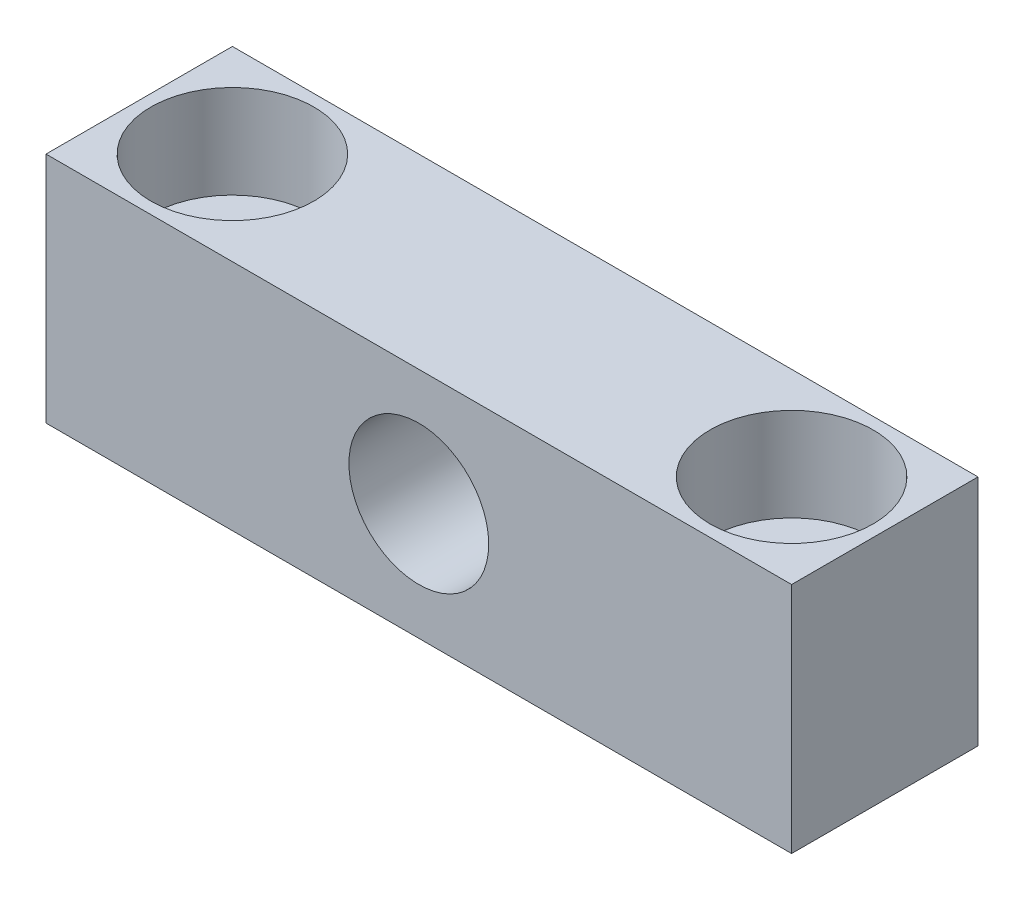
ISO-10303-21;
HEADER;
FILE_DESCRIPTION(('STEP AP214'),'2;1');
FILE_NAME('part.step','',(''),(''),'','','');
FILE_SCHEMA(('AUTOMOTIVE_DESIGN { 1 0 10303 214 1 1 1 1 }'));
ENDSEC;
DATA;
#1=APPLICATION_CONTEXT('core data for automotive mechanical design processes');
#2=APPLICATION_PROTOCOL_DEFINITION('international standard','automotive_design',2000,#1);
#3=PRODUCT_CONTEXT('',#1,'mechanical');
#4=PRODUCT('Part','Part','',(#3));
#5=PRODUCT_RELATED_PRODUCT_CATEGORY('part','',(#4));
#6=PRODUCT_DEFINITION_FORMATION('','',#4);
#7=PRODUCT_DEFINITION_CONTEXT('part definition',#1,'design');
#8=PRODUCT_DEFINITION('design','',#6,#7);
#9=PRODUCT_DEFINITION_SHAPE('','',#8);
#10=(LENGTH_UNIT() NAMED_UNIT(*) SI_UNIT(.MILLI.,.METRE.));
#11=(NAMED_UNIT(*) PLANE_ANGLE_UNIT() SI_UNIT($,.RADIAN.));
#12=(NAMED_UNIT(*) SI_UNIT($,.STERADIAN.) SOLID_ANGLE_UNIT());
#13=UNCERTAINTY_MEASURE_WITH_UNIT(LENGTH_MEASURE(1.E-05),#10,'distance_accuracy_value','');
#14=(GEOMETRIC_REPRESENTATION_CONTEXT(3) GLOBAL_UNCERTAINTY_ASSIGNED_CONTEXT((#13)) GLOBAL_UNIT_ASSIGNED_CONTEXT((#10,
#11,#12)) REPRESENTATION_CONTEXT('',''));
#15=CARTESIAN_POINT('',(0.,0.,0.));
#16=DIRECTION('',(0.,0.,1.));
#17=DIRECTION('',(1.,0.,0.));
#18=AXIS2_PLACEMENT_3D('',#15,#16,#17);
#19=CARTESIAN_POINT('',(-25.4,15.875,-6.35));
#20=DIRECTION('',(1.,0.,0.));
#21=DIRECTION('',(0.,0.,-1.));
#22=AXIS2_PLACEMENT_3D('',#19,#20,#21);
#23=PLANE('',#22);
#24=DIRECTION('',(0.,0.,1.));
#25=VECTOR('',#24,1.);
#26=CARTESIAN_POINT('',(-25.4,0.,-6.35));
#27=LINE('',#26,#25);
#28=CARTESIAN_POINT('',(-25.4,0.,-6.35));
#29=VERTEX_POINT('',#28);
#30=CARTESIAN_POINT('',(-25.4,0.,6.35));
#31=VERTEX_POINT('',#30);
#32=EDGE_CURVE('E100',#29,#31,#27,.T.);
#33=ORIENTED_EDGE('',*,*,#32,.T.);
#34=DIRECTION('',(0.,-1.,0.));
#35=VECTOR('',#34,1.);
#36=CARTESIAN_POINT('',(-25.4,15.875,6.35));
#37=LINE('',#36,#35);
#38=CARTESIAN_POINT('',(-25.4,15.875,6.35));
#39=VERTEX_POINT('',#38);
#40=EDGE_CURVE('E11',#39,#31,#37,.T.);
#41=ORIENTED_EDGE('',*,*,#40,.F.);
#42=DIRECTION('',(0.,0.,1.));
#43=VECTOR('',#42,1.);
#44=CARTESIAN_POINT('',(-25.4,15.875,-6.35));
#45=LINE('',#44,#43);
#46=CARTESIAN_POINT('',(-25.4,15.875,-6.35));
#47=VERTEX_POINT('',#46);
#48=EDGE_CURVE('E88',#47,#39,#45,.T.);
#49=ORIENTED_EDGE('',*,*,#48,.F.);
#50=DIRECTION('',(0.,-1.,0.));
#51=VECTOR('',#50,1.);
#52=CARTESIAN_POINT('',(-25.4,15.875,-6.35));
#53=LINE('',#52,#51);
#54=EDGE_CURVE('E96',#47,#29,#53,.T.);
#55=ORIENTED_EDGE('',*,*,#54,.T.);
#56=EDGE_LOOP('',(#33,#41,#49,#55));
#57=FACE_BOUND('',#56,.T.);
#58=ADVANCED_FACE('F37',(#57),#23,.F.);
#59=CARTESIAN_POINT('',(-25.4,15.875,6.35));
#60=DIRECTION('',(0.,0.,-1.));
#61=DIRECTION('',(-1.,0.,0.));
#62=AXIS2_PLACEMENT_3D('',#59,#60,#61);
#63=PLANE('',#62);
#64=CARTESIAN_POINT('',(0.,7.9375,6.35));
#65=DIRECTION('',(0.,0.,1.));
#66=DIRECTION('',(1.,0.,0.));
#67=AXIS2_PLACEMENT_3D('',#64,#65,#66);
#68=CIRCLE('',#67,4.7625);
#69=CARTESIAN_POINT('',(4.7625,7.9375,6.35));
#70=VERTEX_POINT('',#69);
#71=EDGE_CURVE('E114',#70,#70,#68,.T.);
#72=ORIENTED_EDGE('',*,*,#71,.F.);
#73=EDGE_LOOP('',(#72));
#74=FACE_BOUND('',#73,.T.);
#75=DIRECTION('',(1.,0.,0.));
#76=VECTOR('',#75,1.);
#77=CARTESIAN_POINT('',(-25.4,0.,6.35));
#78=LINE('',#77,#76);
#79=CARTESIAN_POINT('',(25.4,0.,6.35));
#80=VERTEX_POINT('',#79);
#81=EDGE_CURVE('E92',#31,#80,#78,.T.);
#82=ORIENTED_EDGE('',*,*,#81,.T.);
#83=DIRECTION('',(0.,-1.,0.));
#84=VECTOR('',#83,1.);
#85=CARTESIAN_POINT('',(25.4,15.875,6.35));
#86=LINE('',#85,#84);
#87=CARTESIAN_POINT('',(25.4,15.875,6.35));
#88=VERTEX_POINT('',#87);
#89=EDGE_CURVE('E45',#88,#80,#86,.T.);
#90=ORIENTED_EDGE('',*,*,#89,.F.);
#91=DIRECTION('',(1.,0.,0.));
#92=VECTOR('',#91,1.);
#93=CARTESIAN_POINT('',(-25.4,15.875,6.35));
#94=LINE('',#93,#92);
#95=EDGE_CURVE('E83',#39,#88,#94,.T.);
#96=ORIENTED_EDGE('',*,*,#95,.F.);
#97=ORIENTED_EDGE('',*,*,#40,.T.);
#98=EDGE_LOOP('',(#82,#90,#96,#97));
#99=FACE_BOUND('',#98,.T.);
#100=ADVANCED_FACE('F91',(#74,#99),#63,.F.);
#101=CARTESIAN_POINT('',(25.4,15.875,-6.35));
#102=DIRECTION('',(-1.,0.,0.));
#103=DIRECTION('',(0.,0.,1.));
#104=AXIS2_PLACEMENT_3D('',#101,#102,#103);
#105=PLANE('',#104);
#106=DIRECTION('',(0.,0.,-1.));
#107=VECTOR('',#106,1.);
#108=CARTESIAN_POINT('',(25.4,0.,-6.35));
#109=LINE('',#108,#107);
#110=CARTESIAN_POINT('',(25.4,0.,-6.35));
#111=VERTEX_POINT('',#110);
#112=EDGE_CURVE('E70',#80,#111,#109,.T.);
#113=ORIENTED_EDGE('',*,*,#112,.T.);
#114=DIRECTION('',(0.,-1.,0.));
#115=VECTOR('',#114,1.);
#116=CARTESIAN_POINT('',(25.4,15.875,-6.35));
#117=LINE('',#116,#115);
#118=CARTESIAN_POINT('',(25.4,15.875,-6.35));
#119=VERTEX_POINT('',#118);
#120=EDGE_CURVE('E93',#119,#111,#117,.T.);
#121=ORIENTED_EDGE('',*,*,#120,.F.);
#122=DIRECTION('',(0.,0.,-1.));
#123=VECTOR('',#122,1.);
#124=CARTESIAN_POINT('',(25.4,15.875,-6.35));
#125=LINE('',#124,#123);
#126=EDGE_CURVE('E86',#88,#119,#125,.T.);
#127=ORIENTED_EDGE('',*,*,#126,.F.);
#128=ORIENTED_EDGE('',*,*,#89,.T.);
#129=EDGE_LOOP('',(#113,#121,#127,#128));
#130=FACE_BOUND('',#129,.T.);
#131=ADVANCED_FACE('F94',(#130),#105,.F.);
#132=CARTESIAN_POINT('',(-25.4,15.875,-6.35));
#133=DIRECTION('',(0.,0.,1.));
#134=DIRECTION('',(1.,0.,0.));
#135=AXIS2_PLACEMENT_3D('',#132,#133,#134);
#136=PLANE('',#135);
#137=CARTESIAN_POINT('',(0.,7.9375,-6.35));
#138=DIRECTION('',(0.,0.,1.));
#139=DIRECTION('',(1.,0.,0.));
#140=AXIS2_PLACEMENT_3D('',#137,#138,#139);
#141=CIRCLE('',#140,4.7625);
#142=CARTESIAN_POINT('',(4.7625,7.9375,-6.35));
#143=VERTEX_POINT('',#142);
#144=EDGE_CURVE('E103',#143,#143,#141,.T.);
#145=ORIENTED_EDGE('',*,*,#144,.T.);
#146=EDGE_LOOP('',(#145));
#147=FACE_BOUND('',#146,.T.);
#148=DIRECTION('',(-1.,0.,0.));
#149=VECTOR('',#148,1.);
#150=CARTESIAN_POINT('',(-25.4,0.,-6.35));
#151=LINE('',#150,#149);
#152=EDGE_CURVE('E76',#111,#29,#151,.T.);
#153=ORIENTED_EDGE('',*,*,#152,.T.);
#154=ORIENTED_EDGE('',*,*,#54,.F.);
#155=DIRECTION('',(-1.,0.,0.));
#156=VECTOR('',#155,1.);
#157=CARTESIAN_POINT('',(-25.4,15.875,-6.35));
#158=LINE('',#157,#156);
#159=EDGE_CURVE('E53',#119,#47,#158,.T.);
#160=ORIENTED_EDGE('',*,*,#159,.F.);
#161=ORIENTED_EDGE('',*,*,#120,.T.);
#162=EDGE_LOOP('',(#153,#154,#160,#161));
#163=FACE_BOUND('',#162,.T.);
#164=ADVANCED_FACE('F108',(#147,#163),#136,.F.);
#165=CARTESIAN_POINT('',(-25.4,15.875,6.35));
#166=DIRECTION('',(0.,1.,0.));
#167=DIRECTION('',(0.,0.,1.));
#168=AXIS2_PLACEMENT_3D('',#165,#166,#167);
#169=PLANE('',#168);
#170=CARTESIAN_POINT('',(19.05,15.875,0.));
#171=DIRECTION('',(0.,1.,0.));
#172=DIRECTION('',(0.,0.,1.));
#173=AXIS2_PLACEMENT_3D('',#170,#171,#172);
#174=CIRCLE('',#173,5.55625);
#175=CARTESIAN_POINT('',(19.05,15.875,5.55624999999999));
#176=VERTEX_POINT('',#175);
#177=EDGE_CURVE('E140',#176,#176,#174,.T.);
#178=ORIENTED_EDGE('',*,*,#177,.F.);
#179=EDGE_LOOP('',(#178));
#180=FACE_BOUND('',#179,.T.);
#181=CARTESIAN_POINT('',(-19.05,15.875,0.));
#182=DIRECTION('',(0.,1.,0.));
#183=DIRECTION('',(0.,0.,1.));
#184=AXIS2_PLACEMENT_3D('',#181,#182,#183);
#185=CIRCLE('',#184,5.55625);
#186=CARTESIAN_POINT('',(-19.05,15.875,5.55624999999999));
#187=VERTEX_POINT('',#186);
#188=EDGE_CURVE('E128',#187,#187,#185,.T.);
#189=ORIENTED_EDGE('',*,*,#188,.F.);
#190=EDGE_LOOP('',(#189));
#191=FACE_BOUND('',#190,.T.);
#192=ORIENTED_EDGE('',*,*,#48,.T.);
#193=ORIENTED_EDGE('',*,*,#95,.T.);
#194=ORIENTED_EDGE('',*,*,#126,.T.);
#195=ORIENTED_EDGE('',*,*,#159,.T.);
#196=EDGE_LOOP('',(#192,#193,#194,#195));
#197=FACE_BOUND('',#196,.T.);
#198=ADVANCED_FACE('F84',(#180,#191,#197),#169,.T.);
#199=CARTESIAN_POINT('',(-25.4,0.,6.35));
#200=DIRECTION('',(0.,1.,0.));
#201=DIRECTION('',(0.,0.,1.));
#202=AXIS2_PLACEMENT_3D('',#199,#200,#201);
#203=PLANE('',#202);
#204=CARTESIAN_POINT('',(19.05,0.,0.));
#205=DIRECTION('',(0.,1.,0.));
#206=DIRECTION('',(0.,0.,1.));
#207=AXIS2_PLACEMENT_3D('',#204,#205,#206);
#208=CIRCLE('',#207,3.37819999999999);
#209=CARTESIAN_POINT('',(19.05,0.,3.37819999999999));
#210=VERTEX_POINT('',#209);
#211=EDGE_CURVE('E131',#210,#210,#208,.T.);
#212=ORIENTED_EDGE('',*,*,#211,.T.);
#213=EDGE_LOOP('',(#212));
#214=FACE_BOUND('',#213,.T.);
#215=CARTESIAN_POINT('',(-19.05,0.,0.));
#216=DIRECTION('',(0.,1.,0.));
#217=DIRECTION('',(0.,0.,1.));
#218=AXIS2_PLACEMENT_3D('',#215,#216,#217);
#219=CIRCLE('',#218,3.37819999999999);
#220=CARTESIAN_POINT('',(-19.05,0.,3.37819999999999));
#221=VERTEX_POINT('',#220);
#222=EDGE_CURVE('E117',#221,#221,#219,.T.);
#223=ORIENTED_EDGE('',*,*,#222,.T.);
#224=EDGE_LOOP('',(#223));
#225=FACE_BOUND('',#224,.T.);
#226=ORIENTED_EDGE('',*,*,#32,.F.);
#227=ORIENTED_EDGE('',*,*,#152,.F.);
#228=ORIENTED_EDGE('',*,*,#112,.F.);
#229=ORIENTED_EDGE('',*,*,#81,.F.);
#230=EDGE_LOOP('',(#226,#227,#228,#229));
#231=FACE_BOUND('',#230,.T.);
#232=ADVANCED_FACE('F111',(#214,#225,#231),#203,.F.);
#233=CARTESIAN_POINT('',(0.,7.9375,-6.35));
#234=DIRECTION('',(0.,0.,1.));
#235=DIRECTION('',(1.,0.,0.));
#236=AXIS2_PLACEMENT_3D('',#233,#234,#235);
#237=CYLINDRICAL_SURFACE('',#236,4.7625);
#238=ORIENTED_EDGE('',*,*,#144,.F.);
#239=EDGE_LOOP('',(#238));
#240=FACE_BOUND('',#239,.T.);
#241=ORIENTED_EDGE('',*,*,#71,.T.);
#242=EDGE_LOOP('',(#241));
#243=FACE_BOUND('',#242,.T.);
#244=ADVANCED_FACE('F183',(#240,#243),#237,.F.);
#245=CARTESIAN_POINT('',(-19.05,15.875,0.));
#246=DIRECTION('',(0.,1.,0.));
#247=DIRECTION('',(0.,0.,1.));
#248=AXIS2_PLACEMENT_3D('',#245,#246,#247);
#249=CYLINDRICAL_SURFACE('',#248,3.3782);
#250=ORIENTED_EDGE('',*,*,#222,.F.);
#251=EDGE_LOOP('',(#250));
#252=FACE_BOUND('',#251,.T.);
#253=CARTESIAN_POINT('',(-19.05,9.525,0.));
#254=DIRECTION('',(0.,1.,0.));
#255=DIRECTION('',(0.,0.,1.));
#256=AXIS2_PLACEMENT_3D('',#253,#254,#255);
#257=CIRCLE('',#256,3.37820000000001);
#258=CARTESIAN_POINT('',(-19.05,9.525,3.37820000000001));
#259=VERTEX_POINT('',#258);
#260=EDGE_CURVE('E122',#259,#259,#257,.T.);
#261=ORIENTED_EDGE('',*,*,#260,.T.);
#262=EDGE_LOOP('',(#261));
#263=FACE_BOUND('',#262,.T.);
#264=ADVANCED_FACE('F164',(#252,#263),#249,.F.);
#265=CARTESIAN_POINT('',(-15.6718,9.525,0.));
#266=DIRECTION('',(0.,-1.,0.));
#267=DIRECTION('',(0.,0.,-1.));
#268=AXIS2_PLACEMENT_3D('',#265,#266,#267);
#269=PLANE('',#268);
#270=ORIENTED_EDGE('',*,*,#260,.F.);
#271=EDGE_LOOP('',(#270));
#272=FACE_BOUND('',#271,.T.);
#273=CARTESIAN_POINT('',(-19.05,9.525,0.));
#274=DIRECTION('',(0.,1.,0.));
#275=DIRECTION('',(0.,0.,1.));
#276=AXIS2_PLACEMENT_3D('',#273,#274,#275);
#277=CIRCLE('',#276,5.55625);
#278=CARTESIAN_POINT('',(-19.05,9.525,5.55624999999999));
#279=VERTEX_POINT('',#278);
#280=EDGE_CURVE('E125',#279,#279,#277,.T.);
#281=ORIENTED_EDGE('',*,*,#280,.T.);
#282=EDGE_LOOP('',(#281));
#283=FACE_BOUND('',#282,.T.);
#284=ADVANCED_FACE('F154',(#272,#283),#269,.F.);
#285=CARTESIAN_POINT('',(-19.05,15.875,0.));
#286=DIRECTION('',(0.,1.,0.));
#287=DIRECTION('',(0.,0.,1.));
#288=AXIS2_PLACEMENT_3D('',#285,#286,#287);
#289=CYLINDRICAL_SURFACE('',#288,5.55625);
#290=ORIENTED_EDGE('',*,*,#280,.F.);
#291=EDGE_LOOP('',(#290));
#292=FACE_BOUND('',#291,.T.);
#293=ORIENTED_EDGE('',*,*,#188,.T.);
#294=EDGE_LOOP('',(#293));
#295=FACE_BOUND('',#294,.T.);
#296=ADVANCED_FACE('F151',(#292,#295),#289,.F.);
#297=CARTESIAN_POINT('',(19.05,15.875,0.));
#298=DIRECTION('',(0.,1.,0.));
#299=DIRECTION('',(0.,0.,1.));
#300=AXIS2_PLACEMENT_3D('',#297,#298,#299);
#301=CYLINDRICAL_SURFACE('',#300,3.3782);
#302=ORIENTED_EDGE('',*,*,#211,.F.);
#303=EDGE_LOOP('',(#302));
#304=FACE_BOUND('',#303,.T.);
#305=CARTESIAN_POINT('',(19.05,9.525,0.));
#306=DIRECTION('',(0.,1.,0.));
#307=DIRECTION('',(0.,0.,1.));
#308=AXIS2_PLACEMENT_3D('',#305,#306,#307);
#309=CIRCLE('',#308,3.37820000000001);
#310=CARTESIAN_POINT('',(19.05,9.525,3.37820000000001));
#311=VERTEX_POINT('',#310);
#312=EDGE_CURVE('E134',#311,#311,#309,.T.);
#313=ORIENTED_EDGE('',*,*,#312,.T.);
#314=EDGE_LOOP('',(#313));
#315=FACE_BOUND('',#314,.T.);
#316=ADVANCED_FACE('F153',(#304,#315),#301,.F.);
#317=CARTESIAN_POINT('',(22.4282,9.525,0.));
#318=DIRECTION('',(0.,-1.,0.));
#319=DIRECTION('',(0.,0.,-1.));
#320=AXIS2_PLACEMENT_3D('',#317,#318,#319);
#321=PLANE('',#320);
#322=ORIENTED_EDGE('',*,*,#312,.F.);
#323=EDGE_LOOP('',(#322));
#324=FACE_BOUND('',#323,.T.);
#325=CARTESIAN_POINT('',(19.05,9.525,0.));
#326=DIRECTION('',(0.,1.,0.));
#327=DIRECTION('',(0.,0.,1.));
#328=AXIS2_PLACEMENT_3D('',#325,#326,#327);
#329=CIRCLE('',#328,5.55625);
#330=CARTESIAN_POINT('',(19.05,9.525,5.55624999999999));
#331=VERTEX_POINT('',#330);
#332=EDGE_CURVE('E137',#331,#331,#329,.T.);
#333=ORIENTED_EDGE('',*,*,#332,.T.);
#334=EDGE_LOOP('',(#333));
#335=FACE_BOUND('',#334,.T.);
#336=ADVANCED_FACE('F161',(#324,#335),#321,.F.);
#337=CARTESIAN_POINT('',(19.05,15.875,0.));
#338=DIRECTION('',(0.,1.,0.));
#339=DIRECTION('',(0.,0.,1.));
#340=AXIS2_PLACEMENT_3D('',#337,#338,#339);
#341=CYLINDRICAL_SURFACE('',#340,5.55625);
#342=ORIENTED_EDGE('',*,*,#332,.F.);
#343=EDGE_LOOP('',(#342));
#344=FACE_BOUND('',#343,.T.);
#345=ORIENTED_EDGE('',*,*,#177,.T.);
#346=EDGE_LOOP('',(#345));
#347=FACE_BOUND('',#346,.T.);
#348=ADVANCED_FACE('F144',(#344,#347),#341,.F.);
#349=CLOSED_SHELL('',(#58,#100,#131,#164,#198,#232,#244,#264,#284,#296,#316,#336,#348));
#350=MANIFOLD_SOLID_BREP('B2',#349);
#351=ADVANCED_BREP_SHAPE_REPRESENTATION('',(#18,#350),#14);
#352=SHAPE_DEFINITION_REPRESENTATION(#9,#351);
ENDSEC;
END-ISO-10303-21;
